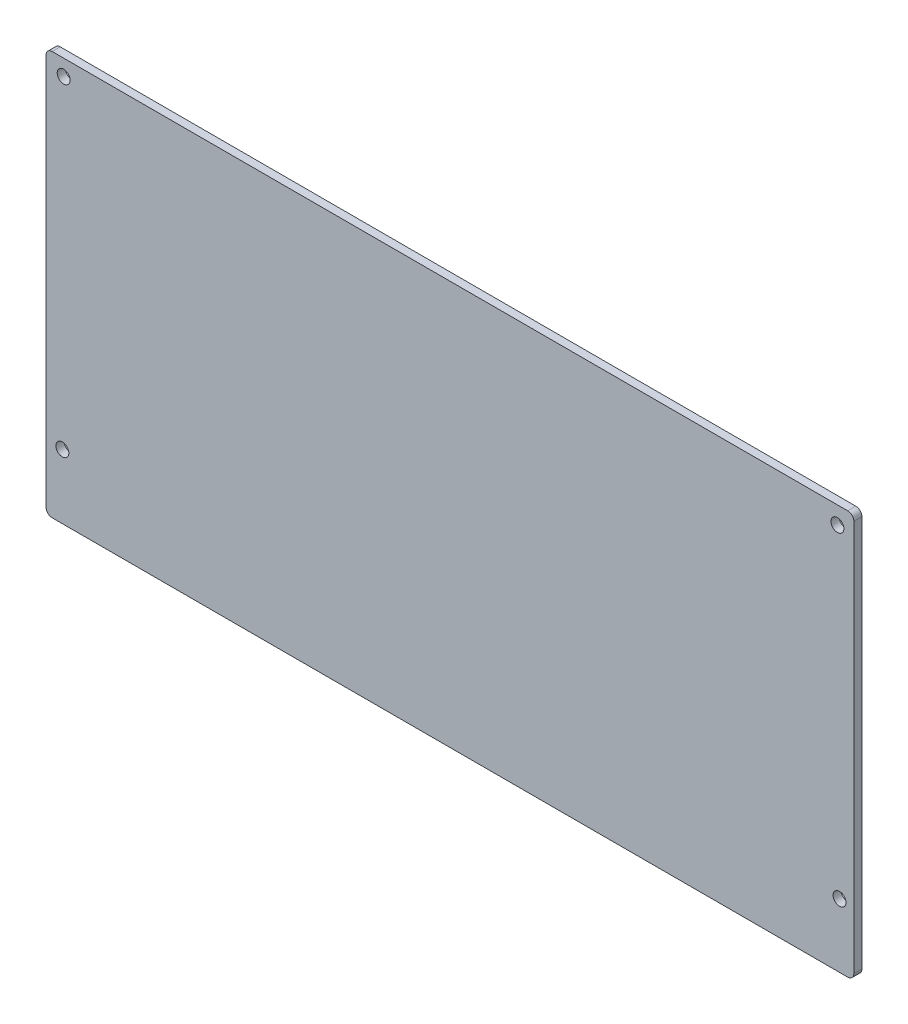
ISO-10303-21;
HEADER;
FILE_DESCRIPTION(('STEP AP214'),'2;1');
FILE_NAME('part.step','',(''),(''),'','','');
FILE_SCHEMA(('AUTOMOTIVE_DESIGN { 1 0 10303 214 1 1 1 1 }'));
ENDSEC;
DATA;
#1=APPLICATION_CONTEXT('core data for automotive mechanical design processes');
#2=APPLICATION_PROTOCOL_DEFINITION('international standard','automotive_design',2000,#1);
#3=PRODUCT_CONTEXT('',#1,'mechanical');
#4=PRODUCT('Part','Part','',(#3));
#5=PRODUCT_RELATED_PRODUCT_CATEGORY('part','',(#4));
#6=PRODUCT_DEFINITION_FORMATION('','',#4);
#7=PRODUCT_DEFINITION_CONTEXT('part definition',#1,'design');
#8=PRODUCT_DEFINITION('design','',#6,#7);
#9=PRODUCT_DEFINITION_SHAPE('','',#8);
#10=(LENGTH_UNIT() NAMED_UNIT(*) SI_UNIT(.MILLI.,.METRE.));
#11=(NAMED_UNIT(*) PLANE_ANGLE_UNIT() SI_UNIT($,.RADIAN.));
#12=(NAMED_UNIT(*) SI_UNIT($,.STERADIAN.) SOLID_ANGLE_UNIT());
#13=UNCERTAINTY_MEASURE_WITH_UNIT(LENGTH_MEASURE(1.E-05),#10,'distance_accuracy_value','');
#14=(GEOMETRIC_REPRESENTATION_CONTEXT(3) GLOBAL_UNCERTAINTY_ASSIGNED_CONTEXT((#13)) GLOBAL_UNIT_ASSIGNED_CONTEXT((#10,
#11,#12)) REPRESENTATION_CONTEXT('',''));
#15=CARTESIAN_POINT('',(0.,0.,0.));
#16=DIRECTION('',(0.,0.,1.));
#17=DIRECTION('',(1.,0.,0.));
#18=AXIS2_PLACEMENT_3D('',#15,#16,#17);
#19=CARTESIAN_POINT('',(42.684785369571,-144.8437896875,16.600050800102));
#20=DIRECTION('',(1.,0.,0.));
#21=DIRECTION('',(0.,1.,0.));
#22=AXIS2_PLACEMENT_3D('',#19,#20,#21);
#23=PLANE('',#22);
#24=DIRECTION('',(0.,-1.,0.));
#25=VECTOR('',#24,1.);
#26=CARTESIAN_POINT('',(42.684785369571,-144.8437896875,16.600050800102));
#27=LINE('',#26,#25);
#28=CARTESIAN_POINT('',(42.684785369571,-146.3437896875,16.600050800102));
#29=VERTEX_POINT('',#28);
#30=CARTESIAN_POINT('',(42.684785369571,-243.3437896875,16.600050800102));
#31=VERTEX_POINT('',#30);
#32=EDGE_CURVE('E120',#29,#31,#27,.T.);
#33=ORIENTED_EDGE('',*,*,#32,.F.);
#34=DIRECTION('',(0.,0.,-1.));
#35=VECTOR('',#34,1.);
#36=CARTESIAN_POINT('',(42.684785369571,-146.3437896875,16.600050800102));
#37=LINE('',#36,#35);
#38=CARTESIAN_POINT('',(42.684785369571,-146.3437896875,14.600050800102));
#39=VERTEX_POINT('',#38);
#40=EDGE_CURVE('E105',#29,#39,#37,.T.);
#41=ORIENTED_EDGE('',*,*,#40,.T.);
#42=DIRECTION('',(0.,-1.,0.));
#43=VECTOR('',#42,1.);
#44=CARTESIAN_POINT('',(42.684785369571,-144.8437896875,14.600050800102));
#45=LINE('',#44,#43);
#46=CARTESIAN_POINT('',(42.684785369571,-243.3437896875,14.600050800102));
#47=VERTEX_POINT('',#46);
#48=EDGE_CURVE('E117',#39,#47,#45,.T.);
#49=ORIENTED_EDGE('',*,*,#48,.T.);
#50=DIRECTION('',(0.,0.,-1.));
#51=VECTOR('',#50,1.);
#52=CARTESIAN_POINT('',(42.684785369571,-243.3437896875,16.600050800102));
#53=LINE('',#52,#51);
#54=EDGE_CURVE('E122',#47,#31,#53,.F.);
#55=ORIENTED_EDGE('',*,*,#54,.T.);
#56=EDGE_LOOP('',(#33,#41,#49,#55));
#57=FACE_BOUND('',#56,.T.);
#58=ADVANCED_FACE('F35',(#57),#23,.F.);
#59=CARTESIAN_POINT('',(42.684785369571,-244.8437896875,16.600050800102));
#60=DIRECTION('',(0.,1.,0.));
#61=DIRECTION('',(0.,0.,1.));
#62=AXIS2_PLACEMENT_3D('',#59,#60,#61);
#63=PLANE('',#62);
#64=DIRECTION('',(1.,0.,0.));
#65=VECTOR('',#64,1.);
#66=CARTESIAN_POINT('',(42.684785369571,-244.8437896875,14.600050800102));
#67=LINE('',#66,#65);
#68=CARTESIAN_POINT('',(44.184785369571,-244.8437896875,14.600050800102));
#69=VERTEX_POINT('',#68);
#70=CARTESIAN_POINT('',(241.184785369571,-244.8437896875,14.600050800102));
#71=VERTEX_POINT('',#70);
#72=EDGE_CURVE('E126',#69,#71,#67,.T.);
#73=ORIENTED_EDGE('',*,*,#72,.T.);
#74=DIRECTION('',(0.,0.,-1.));
#75=VECTOR('',#74,1.);
#76=CARTESIAN_POINT('',(241.184785369571,-244.8437896875,16.600050800102));
#77=LINE('',#76,#75);
#78=CARTESIAN_POINT('',(241.184785369571,-244.8437896875,16.600050800102));
#79=VERTEX_POINT('',#78);
#80=EDGE_CURVE('E11',#71,#79,#77,.F.);
#81=ORIENTED_EDGE('',*,*,#80,.T.);
#82=DIRECTION('',(1.,0.,0.));
#83=VECTOR('',#82,1.);
#84=CARTESIAN_POINT('',(42.684785369571,-244.8437896875,16.600050800102));
#85=LINE('',#84,#83);
#86=CARTESIAN_POINT('',(44.184785369571,-244.8437896875,16.600050800102));
#87=VERTEX_POINT('',#86);
#88=EDGE_CURVE('E166',#87,#79,#85,.T.);
#89=ORIENTED_EDGE('',*,*,#88,.F.);
#90=DIRECTION('',(0.,0.,-1.));
#91=VECTOR('',#90,1.);
#92=CARTESIAN_POINT('',(44.184785369571,-244.8437896875,16.600050800102));
#93=LINE('',#92,#91);
#94=EDGE_CURVE('E43',#87,#69,#93,.T.);
#95=ORIENTED_EDGE('',*,*,#94,.T.);
#96=EDGE_LOOP('',(#73,#81,#89,#95));
#97=FACE_BOUND('',#96,.T.);
#98=ADVANCED_FACE('F164',(#97),#63,.F.);
#99=CARTESIAN_POINT('',(242.684785369571,-144.8437896875,16.600050800102));
#100=DIRECTION('',(-1.,0.,0.));
#101=DIRECTION('',(0.,0.,1.));
#102=AXIS2_PLACEMENT_3D('',#99,#100,#101);
#103=PLANE('',#102);
#104=DIRECTION('',(0.,1.,0.));
#105=VECTOR('',#104,1.);
#106=CARTESIAN_POINT('',(242.684785369571,-144.8437896875,14.600050800102));
#107=LINE('',#106,#105);
#108=CARTESIAN_POINT('',(242.684785369571,-243.3437896875,14.600050800102));
#109=VERTEX_POINT('',#108);
#110=CARTESIAN_POINT('',(242.684785369571,-146.3437896875,14.600050800102));
#111=VERTEX_POINT('',#110);
#112=EDGE_CURVE('E130',#109,#111,#107,.T.);
#113=ORIENTED_EDGE('',*,*,#112,.T.);
#114=DIRECTION('',(0.,0.,-1.));
#115=VECTOR('',#114,1.);
#116=CARTESIAN_POINT('',(242.684785369571,-146.3437896875,16.600050800102));
#117=LINE('',#116,#115);
#118=CARTESIAN_POINT('',(242.684785369571,-146.3437896875,16.600050800102));
#119=VERTEX_POINT('',#118);
#120=EDGE_CURVE('E50',#111,#119,#117,.F.);
#121=ORIENTED_EDGE('',*,*,#120,.T.);
#122=DIRECTION('',(0.,1.,0.));
#123=VECTOR('',#122,1.);
#124=CARTESIAN_POINT('',(242.684785369571,-144.8437896875,16.600050800102));
#125=LINE('',#124,#123);
#126=CARTESIAN_POINT('',(242.684785369571,-243.3437896875,16.600050800102));
#127=VERTEX_POINT('',#126);
#128=EDGE_CURVE('E174',#127,#119,#125,.T.);
#129=ORIENTED_EDGE('',*,*,#128,.F.);
#130=DIRECTION('',(0.,0.,-1.));
#131=VECTOR('',#130,1.);
#132=CARTESIAN_POINT('',(242.684785369571,-243.3437896875,16.600050800102));
#133=LINE('',#132,#131);
#134=EDGE_CURVE('E157',#127,#109,#133,.T.);
#135=ORIENTED_EDGE('',*,*,#134,.T.);
#136=EDGE_LOOP('',(#113,#121,#129,#135));
#137=FACE_BOUND('',#136,.T.);
#138=ADVANCED_FACE('F173',(#137),#103,.F.);
#139=CARTESIAN_POINT('',(42.684785369571,-144.8437896875,16.600050800102));
#140=DIRECTION('',(0.,-1.,0.));
#141=DIRECTION('',(0.,0.,-1.));
#142=AXIS2_PLACEMENT_3D('',#139,#140,#141);
#143=PLANE('',#142);
#144=DIRECTION('',(-1.,0.,0.));
#145=VECTOR('',#144,1.);
#146=CARTESIAN_POINT('',(42.684785369571,-144.8437896875,14.600050800102));
#147=LINE('',#146,#145);
#148=CARTESIAN_POINT('',(241.184785369571,-144.8437896875,14.600050800102));
#149=VERTEX_POINT('',#148);
#150=CARTESIAN_POINT('',(44.184785369571,-144.8437896875,14.600050800102));
#151=VERTEX_POINT('',#150);
#152=EDGE_CURVE('E140',#149,#151,#147,.T.);
#153=ORIENTED_EDGE('',*,*,#152,.T.);
#154=DIRECTION('',(0.,0.,-1.));
#155=VECTOR('',#154,1.);
#156=CARTESIAN_POINT('',(44.184785369571,-144.8437896875,16.600050800102));
#157=LINE('',#156,#155);
#158=CARTESIAN_POINT('',(44.184785369571,-144.8437896875,16.600050800102));
#159=VERTEX_POINT('',#158);
#160=EDGE_CURVE('E106',#151,#159,#157,.F.);
#161=ORIENTED_EDGE('',*,*,#160,.T.);
#162=DIRECTION('',(-1.,0.,0.));
#163=VECTOR('',#162,1.);
#164=CARTESIAN_POINT('',(42.684785369571,-144.8437896875,16.600050800102));
#165=LINE('',#164,#163);
#166=CARTESIAN_POINT('',(241.184785369571,-144.8437896875,16.600050800102));
#167=VERTEX_POINT('',#166);
#168=EDGE_CURVE('E136',#167,#159,#165,.T.);
#169=ORIENTED_EDGE('',*,*,#168,.F.);
#170=DIRECTION('',(0.,0.,-1.));
#171=VECTOR('',#170,1.);
#172=CARTESIAN_POINT('',(241.184785369571,-144.8437896875,16.600050800102));
#173=LINE('',#172,#171);
#174=EDGE_CURVE('E111',#167,#149,#173,.T.);
#175=ORIENTED_EDGE('',*,*,#174,.T.);
#176=EDGE_LOOP('',(#153,#161,#169,#175));
#177=FACE_BOUND('',#176,.T.);
#178=ADVANCED_FACE('F214',(#177),#143,.F.);
#179=CARTESIAN_POINT('',(0.,0.,16.600050800102));
#180=DIRECTION('',(0.,0.,1.));
#181=DIRECTION('',(1.,0.,0.));
#182=AXIS2_PLACEMENT_3D('',#179,#180,#181);
#183=PLANE('',#182);
#184=CARTESIAN_POINT('',(238.624235090618,-149.169262016877,16.600050800102));
#185=DIRECTION('',(0.,0.,1.));
#186=DIRECTION('',(1.,0.,0.));
#187=AXIS2_PLACEMENT_3D('',#184,#185,#186);
#188=CIRCLE('',#187,1.59999999999999);
#189=CARTESIAN_POINT('',(240.224235090618,-149.169262016877,16.600050800102));
#190=VERTEX_POINT('',#189);
#191=EDGE_CURVE('E190',#190,#190,#188,.T.);
#192=ORIENTED_EDGE('',*,*,#191,.F.);
#193=EDGE_LOOP('',(#192));
#194=FACE_BOUND('',#193,.T.);
#195=CARTESIAN_POINT('',(46.7077050039712,-228.912665547183,16.600050800102));
#196=DIRECTION('',(0.,0.,1.));
#197=DIRECTION('',(1.,0.,0.));
#198=AXIS2_PLACEMENT_3D('',#195,#196,#197);
#199=CIRCLE('',#198,1.6);
#200=CARTESIAN_POINT('',(48.3077050039712,-228.912665547183,16.600050800102));
#201=VERTEX_POINT('',#200);
#202=EDGE_CURVE('E183',#201,#201,#199,.T.);
#203=ORIENTED_EDGE('',*,*,#202,.F.);
#204=EDGE_LOOP('',(#203));
#205=FACE_BOUND('',#204,.T.);
#206=CARTESIAN_POINT('',(239.146864790084,-229.075018549619,16.600050800102));
#207=DIRECTION('',(0.,0.,1.));
#208=DIRECTION('',(1.,0.,0.));
#209=AXIS2_PLACEMENT_3D('',#206,#207,#208);
#210=CIRCLE('',#209,1.59999999999999);
#211=CARTESIAN_POINT('',(240.746864790084,-229.075018549619,16.600050800102));
#212=VERTEX_POINT('',#211);
#213=EDGE_CURVE('E195',#212,#212,#210,.T.);
#214=ORIENTED_EDGE('',*,*,#213,.F.);
#215=EDGE_LOOP('',(#214));
#216=FACE_BOUND('',#215,.T.);
#217=CARTESIAN_POINT('',(47.0336034130701,-148.804542119204,16.600050800102));
#218=DIRECTION('',(0.,0.,1.));
#219=DIRECTION('',(1.,0.,0.));
#220=AXIS2_PLACEMENT_3D('',#217,#218,#219);
#221=CIRCLE('',#220,1.6);
#222=CARTESIAN_POINT('',(48.6336034130701,-148.804542119204,16.600050800102));
#223=VERTEX_POINT('',#222);
#224=EDGE_CURVE('E133',#223,#223,#221,.T.);
#225=ORIENTED_EDGE('',*,*,#224,.F.);
#226=EDGE_LOOP('',(#225));
#227=FACE_BOUND('',#226,.T.);
#228=ORIENTED_EDGE('',*,*,#168,.T.);
#229=CARTESIAN_POINT('',(44.184785369571,-146.3437896875,16.600050800102));
#230=DIRECTION('',(0.,0.,1.));
#231=DIRECTION('',(1.,0.,0.));
#232=AXIS2_PLACEMENT_3D('',#229,#230,#231);
#233=CIRCLE('',#232,1.5);
#234=EDGE_CURVE('E155',#159,#29,#233,.T.);
#235=ORIENTED_EDGE('',*,*,#234,.T.);
#236=ORIENTED_EDGE('',*,*,#32,.T.);
#237=CARTESIAN_POINT('',(44.184785369571,-243.3437896875,16.600050800102));
#238=DIRECTION('',(0.,0.,1.));
#239=DIRECTION('',(1.,0.,0.));
#240=AXIS2_PLACEMENT_3D('',#237,#238,#239);
#241=CIRCLE('',#240,1.5);
#242=EDGE_CURVE('E150',#31,#87,#241,.T.);
#243=ORIENTED_EDGE('',*,*,#242,.T.);
#244=ORIENTED_EDGE('',*,*,#88,.T.);
#245=CARTESIAN_POINT('',(241.184785369571,-243.3437896875,16.600050800102));
#246=DIRECTION('',(0.,0.,1.));
#247=DIRECTION('',(1.,0.,0.));
#248=AXIS2_PLACEMENT_3D('',#245,#246,#247);
#249=CIRCLE('',#248,1.5);
#250=EDGE_CURVE('E57',#79,#127,#249,.T.);
#251=ORIENTED_EDGE('',*,*,#250,.T.);
#252=ORIENTED_EDGE('',*,*,#128,.T.);
#253=CARTESIAN_POINT('',(241.184785369571,-146.3437896875,16.600050800102));
#254=DIRECTION('',(0.,0.,1.));
#255=DIRECTION('',(1.,0.,0.));
#256=AXIS2_PLACEMENT_3D('',#253,#254,#255);
#257=CIRCLE('',#256,1.5);
#258=EDGE_CURVE('E153',#119,#167,#257,.T.);
#259=ORIENTED_EDGE('',*,*,#258,.T.);
#260=EDGE_LOOP('',(#228,#235,#236,#243,#244,#251,#252,#259));
#261=FACE_BOUND('',#260,.T.);
#262=ADVANCED_FACE('F211',(#194,#205,#216,#227,#261),#183,.T.);
#263=CARTESIAN_POINT('',(0.,0.,14.600050800102));
#264=DIRECTION('',(0.,0.,1.));
#265=DIRECTION('',(1.,0.,0.));
#266=AXIS2_PLACEMENT_3D('',#263,#264,#265);
#267=PLANE('',#266);
#268=CARTESIAN_POINT('',(238.624235090618,-149.169262016877,14.600050800102));
#269=DIRECTION('',(0.,0.,1.));
#270=DIRECTION('',(1.,0.,0.));
#271=AXIS2_PLACEMENT_3D('',#268,#269,#270);
#272=CIRCLE('',#271,1.59999999999999);
#273=CARTESIAN_POINT('',(240.224235090618,-149.169262016877,14.600050800102));
#274=VERTEX_POINT('',#273);
#275=EDGE_CURVE('E181',#274,#274,#272,.T.);
#276=ORIENTED_EDGE('',*,*,#275,.T.);
#277=EDGE_LOOP('',(#276));
#278=FACE_BOUND('',#277,.T.);
#279=CARTESIAN_POINT('',(46.7077050039712,-228.912665547183,14.600050800102));
#280=DIRECTION('',(0.,0.,1.));
#281=DIRECTION('',(1.,0.,0.));
#282=AXIS2_PLACEMENT_3D('',#279,#280,#281);
#283=CIRCLE('',#282,1.6);
#284=CARTESIAN_POINT('',(48.3077050039712,-228.912665547183,14.600050800102));
#285=VERTEX_POINT('',#284);
#286=EDGE_CURVE('E186',#285,#285,#283,.T.);
#287=ORIENTED_EDGE('',*,*,#286,.T.);
#288=EDGE_LOOP('',(#287));
#289=FACE_BOUND('',#288,.T.);
#290=CARTESIAN_POINT('',(239.146864790084,-229.075018549619,14.600050800102));
#291=DIRECTION('',(0.,0.,1.));
#292=DIRECTION('',(1.,0.,0.));
#293=AXIS2_PLACEMENT_3D('',#290,#291,#292);
#294=CIRCLE('',#293,1.59999999999999);
#295=CARTESIAN_POINT('',(240.746864790084,-229.075018549619,14.600050800102));
#296=VERTEX_POINT('',#295);
#297=EDGE_CURVE('E187',#296,#296,#294,.T.);
#298=ORIENTED_EDGE('',*,*,#297,.T.);
#299=EDGE_LOOP('',(#298));
#300=FACE_BOUND('',#299,.T.);
#301=CARTESIAN_POINT('',(47.0336034130701,-148.804542119204,14.600050800102));
#302=DIRECTION('',(0.,0.,1.));
#303=DIRECTION('',(1.,0.,0.));
#304=AXIS2_PLACEMENT_3D('',#301,#302,#303);
#305=CIRCLE('',#304,1.6);
#306=CARTESIAN_POINT('',(48.6336034130701,-148.804542119204,14.600050800102));
#307=VERTEX_POINT('',#306);
#308=EDGE_CURVE('E127',#307,#307,#305,.T.);
#309=ORIENTED_EDGE('',*,*,#308,.T.);
#310=EDGE_LOOP('',(#309));
#311=FACE_BOUND('',#310,.T.);
#312=ORIENTED_EDGE('',*,*,#48,.F.);
#313=CARTESIAN_POINT('',(44.184785369571,-146.3437896875,14.600050800102));
#314=DIRECTION('',(0.,0.,1.));
#315=DIRECTION('',(1.,0.,0.));
#316=AXIS2_PLACEMENT_3D('',#313,#314,#315);
#317=CIRCLE('',#316,1.5);
#318=EDGE_CURVE('E101',#39,#151,#317,.F.);
#319=ORIENTED_EDGE('',*,*,#318,.T.);
#320=ORIENTED_EDGE('',*,*,#152,.F.);
#321=CARTESIAN_POINT('',(241.184785369571,-146.3437896875,14.600050800102));
#322=DIRECTION('',(0.,0.,1.));
#323=DIRECTION('',(1.,0.,0.));
#324=AXIS2_PLACEMENT_3D('',#321,#322,#323);
#325=CIRCLE('',#324,1.5);
#326=EDGE_CURVE('E112',#149,#111,#325,.F.);
#327=ORIENTED_EDGE('',*,*,#326,.T.);
#328=ORIENTED_EDGE('',*,*,#112,.F.);
#329=CARTESIAN_POINT('',(241.184785369571,-243.3437896875,14.600050800102));
#330=DIRECTION('',(0.,0.,1.));
#331=DIRECTION('',(1.,0.,0.));
#332=AXIS2_PLACEMENT_3D('',#329,#330,#331);
#333=CIRCLE('',#332,1.5);
#334=EDGE_CURVE('E144',#109,#71,#333,.F.);
#335=ORIENTED_EDGE('',*,*,#334,.T.);
#336=ORIENTED_EDGE('',*,*,#72,.F.);
#337=CARTESIAN_POINT('',(44.184785369571,-243.3437896875,14.600050800102));
#338=DIRECTION('',(0.,0.,1.));
#339=DIRECTION('',(1.,0.,0.));
#340=AXIS2_PLACEMENT_3D('',#337,#338,#339);
#341=CIRCLE('',#340,1.5);
#342=EDGE_CURVE('E121',#69,#47,#341,.F.);
#343=ORIENTED_EDGE('',*,*,#342,.T.);
#344=EDGE_LOOP('',(#312,#319,#320,#327,#328,#335,#336,#343));
#345=FACE_BOUND('',#344,.T.);
#346=ADVANCED_FACE('F124',(#278,#289,#300,#311,#345),#267,.F.);
#347=CARTESIAN_POINT('',(47.0336034130701,-148.804542119204,14.600050800102));
#348=DIRECTION('',(0.,0.,1.));
#349=DIRECTION('',(1.,0.,0.));
#350=AXIS2_PLACEMENT_3D('',#347,#348,#349);
#351=CYLINDRICAL_SURFACE('',#350,1.6);
#352=ORIENTED_EDGE('',*,*,#308,.F.);
#353=EDGE_LOOP('',(#352));
#354=FACE_BOUND('',#353,.T.);
#355=ORIENTED_EDGE('',*,*,#224,.T.);
#356=EDGE_LOOP('',(#355));
#357=FACE_BOUND('',#356,.T.);
#358=ADVANCED_FACE('F207',(#354,#357),#351,.F.);
#359=CARTESIAN_POINT('',(239.146864790084,-229.075018549619,14.600050800102));
#360=DIRECTION('',(0.,0.,1.));
#361=DIRECTION('',(1.,0.,0.));
#362=AXIS2_PLACEMENT_3D('',#359,#360,#361);
#363=CYLINDRICAL_SURFACE('',#362,1.59999999999999);
#364=ORIENTED_EDGE('',*,*,#297,.F.);
#365=EDGE_LOOP('',(#364));
#366=FACE_BOUND('',#365,.T.);
#367=ORIENTED_EDGE('',*,*,#213,.T.);
#368=EDGE_LOOP('',(#367));
#369=FACE_BOUND('',#368,.T.);
#370=ADVANCED_FACE('F203',(#366,#369),#363,.F.);
#371=CARTESIAN_POINT('',(46.7077050039712,-228.912665547183,14.600050800102));
#372=DIRECTION('',(0.,0.,1.));
#373=DIRECTION('',(1.,0.,0.));
#374=AXIS2_PLACEMENT_3D('',#371,#372,#373);
#375=CYLINDRICAL_SURFACE('',#374,1.6);
#376=ORIENTED_EDGE('',*,*,#286,.F.);
#377=EDGE_LOOP('',(#376));
#378=FACE_BOUND('',#377,.T.);
#379=ORIENTED_EDGE('',*,*,#202,.T.);
#380=EDGE_LOOP('',(#379));
#381=FACE_BOUND('',#380,.T.);
#382=ADVANCED_FACE('F206',(#378,#381),#375,.F.);
#383=CARTESIAN_POINT('',(238.624235090618,-149.169262016877,14.600050800102));
#384=DIRECTION('',(0.,0.,1.));
#385=DIRECTION('',(1.,0.,0.));
#386=AXIS2_PLACEMENT_3D('',#383,#384,#385);
#387=CYLINDRICAL_SURFACE('',#386,1.59999999999999);
#388=ORIENTED_EDGE('',*,*,#275,.F.);
#389=EDGE_LOOP('',(#388));
#390=FACE_BOUND('',#389,.T.);
#391=ORIENTED_EDGE('',*,*,#191,.T.);
#392=EDGE_LOOP('',(#391));
#393=FACE_BOUND('',#392,.T.);
#394=ADVANCED_FACE('F229',(#390,#393),#387,.F.);
#395=CARTESIAN_POINT('',(44.184785369571,-146.3437896875,16.600050800102));
#396=DIRECTION('',(0.,0.,-1.));
#397=DIRECTION('',(-1.,0.,0.));
#398=AXIS2_PLACEMENT_3D('',#395,#396,#397);
#399=CYLINDRICAL_SURFACE('',#398,1.5);
#400=ORIENTED_EDGE('',*,*,#234,.F.);
#401=ORIENTED_EDGE('',*,*,#160,.F.);
#402=ORIENTED_EDGE('',*,*,#318,.F.);
#403=ORIENTED_EDGE('',*,*,#40,.F.);
#404=EDGE_LOOP('',(#400,#401,#402,#403));
#405=FACE_BOUND('',#404,.T.);
#406=ADVANCED_FACE('F104',(#405),#399,.T.);
#407=CARTESIAN_POINT('',(241.184785369571,-146.3437896875,16.600050800102));
#408=DIRECTION('',(0.,0.,-1.));
#409=DIRECTION('',(-1.,0.,0.));
#410=AXIS2_PLACEMENT_3D('',#407,#408,#409);
#411=CYLINDRICAL_SURFACE('',#410,1.5);
#412=ORIENTED_EDGE('',*,*,#258,.F.);
#413=ORIENTED_EDGE('',*,*,#120,.F.);
#414=ORIENTED_EDGE('',*,*,#326,.F.);
#415=ORIENTED_EDGE('',*,*,#174,.F.);
#416=EDGE_LOOP('',(#412,#413,#414,#415));
#417=FACE_BOUND('',#416,.T.);
#418=ADVANCED_FACE('F222',(#417),#411,.T.);
#419=CARTESIAN_POINT('',(241.184785369571,-243.3437896875,16.600050800102));
#420=DIRECTION('',(0.,0.,-1.));
#421=DIRECTION('',(-1.,0.,0.));
#422=AXIS2_PLACEMENT_3D('',#419,#420,#421);
#423=CYLINDRICAL_SURFACE('',#422,1.5);
#424=ORIENTED_EDGE('',*,*,#250,.F.);
#425=ORIENTED_EDGE('',*,*,#80,.F.);
#426=ORIENTED_EDGE('',*,*,#334,.F.);
#427=ORIENTED_EDGE('',*,*,#134,.F.);
#428=EDGE_LOOP('',(#424,#425,#426,#427));
#429=FACE_BOUND('',#428,.T.);
#430=ADVANCED_FACE('F172',(#429),#423,.T.);
#431=CARTESIAN_POINT('',(44.184785369571,-243.3437896875,16.600050800102));
#432=DIRECTION('',(0.,0.,-1.));
#433=DIRECTION('',(-1.,0.,0.));
#434=AXIS2_PLACEMENT_3D('',#431,#432,#433);
#435=CYLINDRICAL_SURFACE('',#434,1.5);
#436=ORIENTED_EDGE('',*,*,#242,.F.);
#437=ORIENTED_EDGE('',*,*,#54,.F.);
#438=ORIENTED_EDGE('',*,*,#342,.F.);
#439=ORIENTED_EDGE('',*,*,#94,.F.);
#440=EDGE_LOOP('',(#436,#437,#438,#439));
#441=FACE_BOUND('',#440,.T.);
#442=ADVANCED_FACE('F37',(#441),#435,.T.);
#443=CLOSED_SHELL('',(#58,#98,#138,#178,#262,#346,#358,#370,#382,#394,#406,#418,#430,#442));
#444=MANIFOLD_SOLID_BREP('B2',#443);
#445=ADVANCED_BREP_SHAPE_REPRESENTATION('',(#18,#444),#14);
#446=SHAPE_DEFINITION_REPRESENTATION(#9,#445);
ENDSEC;
END-ISO-10303-21;
